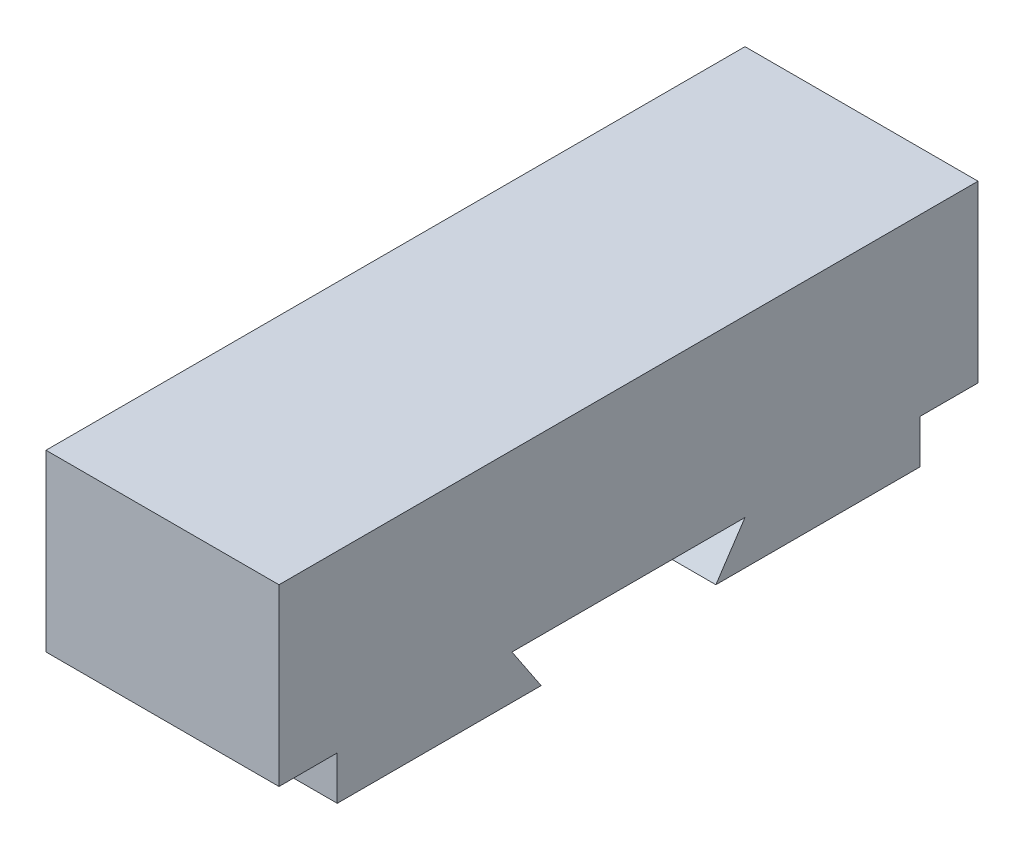
ISO-10303-21;
HEADER;
FILE_DESCRIPTION(('STEP AP214'),'2;1');
FILE_NAME('part.step','',(''),(''),'','','');
FILE_SCHEMA(('AUTOMOTIVE_DESIGN { 1 0 10303 214 1 1 1 1 }'));
ENDSEC;
DATA;
#1=APPLICATION_CONTEXT('core data for automotive mechanical design processes');
#2=APPLICATION_PROTOCOL_DEFINITION('international standard','automotive_design',2000,#1);
#3=PRODUCT_CONTEXT('',#1,'mechanical');
#4=PRODUCT('Part','Part','',(#3));
#5=PRODUCT_RELATED_PRODUCT_CATEGORY('part','',(#4));
#6=PRODUCT_DEFINITION_FORMATION('','',#4);
#7=PRODUCT_DEFINITION_CONTEXT('part definition',#1,'design');
#8=PRODUCT_DEFINITION('design','',#6,#7);
#9=PRODUCT_DEFINITION_SHAPE('','',#8);
#10=(LENGTH_UNIT() NAMED_UNIT(*) SI_UNIT(.MILLI.,.METRE.));
#11=(NAMED_UNIT(*) PLANE_ANGLE_UNIT() SI_UNIT($,.RADIAN.));
#12=(NAMED_UNIT(*) SI_UNIT($,.STERADIAN.) SOLID_ANGLE_UNIT());
#13=UNCERTAINTY_MEASURE_WITH_UNIT(LENGTH_MEASURE(1.E-05),#10,'distance_accuracy_value','');
#14=(GEOMETRIC_REPRESENTATION_CONTEXT(3) GLOBAL_UNCERTAINTY_ASSIGNED_CONTEXT((#13)) GLOBAL_UNIT_ASSIGNED_CONTEXT((#10,
#11,#12)) REPRESENTATION_CONTEXT('',''));
#15=CARTESIAN_POINT('',(0.,0.,0.));
#16=DIRECTION('',(0.,0.,1.));
#17=DIRECTION('',(1.,0.,0.));
#18=AXIS2_PLACEMENT_3D('',#15,#16,#17);
#19=CARTESIAN_POINT('',(-203.2,25.4,63.5000000000001));
#20=DIRECTION('',(0.,0.,1.));
#21=DIRECTION('',(1.,0.,0.));
#22=AXIS2_PLACEMENT_3D('',#19,#20,#21);
#23=PLANE('',#22);
#24=DIRECTION('',(0.,1.,0.));
#25=VECTOR('',#24,1.);
#26=CARTESIAN_POINT('',(-254.,25.4,63.5000000000001));
#27=LINE('',#26,#25);
#28=CARTESIAN_POINT('',(-254.,15.875,63.5000000000001));
#29=VERTEX_POINT('',#28);
#30=CARTESIAN_POINT('',(-254.,25.4,63.5000000000001));
#31=VERTEX_POINT('',#30);
#32=EDGE_CURVE('E153',#29,#31,#27,.T.);
#33=ORIENTED_EDGE('',*,*,#32,.F.);
#34=DIRECTION('',(-1.,0.,0.));
#35=VECTOR('',#34,1.);
#36=CARTESIAN_POINT('',(-203.2,15.875,63.5000000000001));
#37=LINE('',#36,#35);
#38=CARTESIAN_POINT('',(-203.2,15.875,63.5000000000001));
#39=VERTEX_POINT('',#38);
#40=EDGE_CURVE('E11',#39,#29,#37,.T.);
#41=ORIENTED_EDGE('',*,*,#40,.F.);
#42=DIRECTION('',(0.,1.,0.));
#43=VECTOR('',#42,1.);
#44=CARTESIAN_POINT('',(-203.2,25.4,63.5000000000001));
#45=LINE('',#44,#43);
#46=CARTESIAN_POINT('',(-203.2,25.4,63.5000000000001));
#47=VERTEX_POINT('',#46);
#48=EDGE_CURVE('E185',#39,#47,#45,.T.);
#49=ORIENTED_EDGE('',*,*,#48,.T.);
#50=DIRECTION('',(-1.,0.,0.));
#51=VECTOR('',#50,1.);
#52=CARTESIAN_POINT('',(-203.2,25.4,63.5000000000001));
#53=LINE('',#52,#51);
#54=EDGE_CURVE('E35',#47,#31,#53,.T.);
#55=ORIENTED_EDGE('',*,*,#54,.T.);
#56=EDGE_LOOP('',(#33,#41,#49,#55));
#57=FACE_BOUND('',#56,.T.);
#58=ADVANCED_FACE('F32',(#57),#23,.T.);
#59=CARTESIAN_POINT('',(-203.2,15.875,63.5000000000001));
#60=DIRECTION('',(0.,-1.,0.));
#61=DIRECTION('',(0.,0.,-1.));
#62=AXIS2_PLACEMENT_3D('',#59,#60,#61);
#63=PLANE('',#62);
#64=DIRECTION('',(0.,0.,1.));
#65=VECTOR('',#64,1.);
#66=CARTESIAN_POINT('',(-254.,15.875,63.5000000000001));
#67=LINE('',#66,#65);
#68=CARTESIAN_POINT('',(-254.,15.875,19.05));
#69=VERTEX_POINT('',#68);
#70=EDGE_CURVE('E183',#69,#29,#67,.T.);
#71=ORIENTED_EDGE('',*,*,#70,.F.);
#72=DIRECTION('',(-1.,0.,0.));
#73=VECTOR('',#72,1.);
#74=CARTESIAN_POINT('',(-203.2,15.875,19.05));
#75=LINE('',#74,#73);
#76=CARTESIAN_POINT('',(-203.2,15.875,19.05));
#77=VERTEX_POINT('',#76);
#78=EDGE_CURVE('E41',#77,#69,#75,.T.);
#79=ORIENTED_EDGE('',*,*,#78,.F.);
#80=DIRECTION('',(0.,0.,1.));
#81=VECTOR('',#80,1.);
#82=CARTESIAN_POINT('',(-203.2,15.875,63.5000000000001));
#83=LINE('',#82,#81);
#84=EDGE_CURVE('E143',#77,#39,#83,.T.);
#85=ORIENTED_EDGE('',*,*,#84,.T.);
#86=ORIENTED_EDGE('',*,*,#40,.T.);
#87=EDGE_LOOP('',(#71,#79,#85,#86));
#88=FACE_BOUND('',#87,.T.);
#89=ADVANCED_FACE('F205',(#88),#63,.T.);
#90=CARTESIAN_POINT('',(-203.2,15.875,19.05));
#91=DIRECTION('',(0.,0.554700196225229,-0.832050294337844));
#92=DIRECTION('',(0.,0.832050294337844,0.554700196225229));
#93=AXIS2_PLACEMENT_3D('',#90,#91,#92);
#94=PLANE('',#93);
#95=DIRECTION('',(0.,-0.832050294337844,-0.554700196225229));
#96=VECTOR('',#95,1.);
#97=CARTESIAN_POINT('',(-254.,15.875,19.05));
#98=LINE('',#97,#96);
#99=CARTESIAN_POINT('',(-254.,25.4,25.4));
#100=VERTEX_POINT('',#99);
#101=EDGE_CURVE('E130',#100,#69,#98,.T.);
#102=ORIENTED_EDGE('',*,*,#101,.F.);
#103=DIRECTION('',(-1.,0.,0.));
#104=VECTOR('',#103,1.);
#105=CARTESIAN_POINT('',(-203.2,25.4,25.4));
#106=LINE('',#105,#104);
#107=CARTESIAN_POINT('',(-203.2,25.4,25.4));
#108=VERTEX_POINT('',#107);
#109=EDGE_CURVE('E125',#108,#100,#106,.T.);
#110=ORIENTED_EDGE('',*,*,#109,.F.);
#111=DIRECTION('',(0.,-0.832050294337844,-0.554700196225229));
#112=VECTOR('',#111,1.);
#113=CARTESIAN_POINT('',(-203.2,15.875,19.05));
#114=LINE('',#113,#112);
#115=EDGE_CURVE('E128',#108,#77,#114,.T.);
#116=ORIENTED_EDGE('',*,*,#115,.T.);
#117=ORIENTED_EDGE('',*,*,#78,.T.);
#118=EDGE_LOOP('',(#102,#110,#116,#117));
#119=FACE_BOUND('',#118,.T.);
#120=ADVANCED_FACE('F127',(#119),#94,.T.);
#121=CARTESIAN_POINT('',(-203.2,25.4,-25.4));
#122=DIRECTION('',(0.,-1.,0.));
#123=DIRECTION('',(0.,0.,-1.));
#124=AXIS2_PLACEMENT_3D('',#121,#122,#123);
#125=PLANE('',#124);
#126=DIRECTION('',(0.,0.,1.));
#127=VECTOR('',#126,1.);
#128=CARTESIAN_POINT('',(-254.,25.4,-25.4));
#129=LINE('',#128,#127);
#130=CARTESIAN_POINT('',(-254.,25.4,-25.4));
#131=VERTEX_POINT('',#130);
#132=EDGE_CURVE('E180',#131,#100,#129,.T.);
#133=ORIENTED_EDGE('',*,*,#132,.F.);
#134=DIRECTION('',(-1.,0.,0.));
#135=VECTOR('',#134,1.);
#136=CARTESIAN_POINT('',(-203.2,25.4,-25.4));
#137=LINE('',#136,#135);
#138=CARTESIAN_POINT('',(-203.2,25.4,-25.4));
#139=VERTEX_POINT('',#138);
#140=EDGE_CURVE('E135',#139,#131,#137,.T.);
#141=ORIENTED_EDGE('',*,*,#140,.F.);
#142=DIRECTION('',(0.,0.,1.));
#143=VECTOR('',#142,1.);
#144=CARTESIAN_POINT('',(-203.2,25.4,-25.4));
#145=LINE('',#144,#143);
#146=EDGE_CURVE('E141',#139,#108,#145,.T.);
#147=ORIENTED_EDGE('',*,*,#146,.T.);
#148=ORIENTED_EDGE('',*,*,#109,.T.);
#149=EDGE_LOOP('',(#133,#141,#147,#148));
#150=FACE_BOUND('',#149,.T.);
#151=ADVANCED_FACE('F145',(#150),#125,.T.);
#152=CARTESIAN_POINT('',(-203.2,25.4,-25.4));
#153=DIRECTION('',(0.,0.554700196225229,0.832050294337844));
#154=DIRECTION('',(0.,-0.832050294337844,0.554700196225229));
#155=AXIS2_PLACEMENT_3D('',#152,#153,#154);
#156=PLANE('',#155);
#157=DIRECTION('',(0.,0.832050294337844,-0.554700196225229));
#158=VECTOR('',#157,1.);
#159=CARTESIAN_POINT('',(-254.,25.4,-25.4));
#160=LINE('',#159,#158);
#161=CARTESIAN_POINT('',(-254.,15.875,-19.05));
#162=VERTEX_POINT('',#161);
#163=EDGE_CURVE('E177',#162,#131,#160,.T.);
#164=ORIENTED_EDGE('',*,*,#163,.F.);
#165=DIRECTION('',(-1.,0.,0.));
#166=VECTOR('',#165,1.);
#167=CARTESIAN_POINT('',(-203.2,15.875,-19.05));
#168=LINE('',#167,#166);
#169=CARTESIAN_POINT('',(-203.2,15.875,-19.05));
#170=VERTEX_POINT('',#169);
#171=EDGE_CURVE('E189',#170,#162,#168,.T.);
#172=ORIENTED_EDGE('',*,*,#171,.F.);
#173=DIRECTION('',(0.,0.832050294337844,-0.554700196225229));
#174=VECTOR('',#173,1.);
#175=CARTESIAN_POINT('',(-203.2,25.4,-25.4));
#176=LINE('',#175,#174);
#177=EDGE_CURVE('E146',#170,#139,#176,.T.);
#178=ORIENTED_EDGE('',*,*,#177,.T.);
#179=ORIENTED_EDGE('',*,*,#140,.T.);
#180=EDGE_LOOP('',(#164,#172,#178,#179));
#181=FACE_BOUND('',#180,.T.);
#182=ADVANCED_FACE('F219',(#181),#156,.T.);
#183=CARTESIAN_POINT('',(-203.2,15.875,-19.05));
#184=DIRECTION('',(0.,-1.,0.));
#185=DIRECTION('',(0.,0.,-1.));
#186=AXIS2_PLACEMENT_3D('',#183,#184,#185);
#187=PLANE('',#186);
#188=DIRECTION('',(0.,0.,1.));
#189=VECTOR('',#188,1.);
#190=CARTESIAN_POINT('',(-254.,15.875,-19.05));
#191=LINE('',#190,#189);
#192=CARTESIAN_POINT('',(-254.,15.875,-63.5));
#193=VERTEX_POINT('',#192);
#194=EDGE_CURVE('E174',#193,#162,#191,.T.);
#195=ORIENTED_EDGE('',*,*,#194,.F.);
#196=DIRECTION('',(-1.,0.,0.));
#197=VECTOR('',#196,1.);
#198=CARTESIAN_POINT('',(-203.2,15.875,-63.5));
#199=LINE('',#198,#197);
#200=CARTESIAN_POINT('',(-203.2,15.875,-63.5));
#201=VERTEX_POINT('',#200);
#202=EDGE_CURVE('E191',#201,#193,#199,.T.);
#203=ORIENTED_EDGE('',*,*,#202,.F.);
#204=DIRECTION('',(0.,0.,1.));
#205=VECTOR('',#204,1.);
#206=CARTESIAN_POINT('',(-203.2,15.875,-19.05));
#207=LINE('',#206,#205);
#208=EDGE_CURVE('E148',#201,#170,#207,.T.);
#209=ORIENTED_EDGE('',*,*,#208,.T.);
#210=ORIENTED_EDGE('',*,*,#171,.T.);
#211=EDGE_LOOP('',(#195,#203,#209,#210));
#212=FACE_BOUND('',#211,.T.);
#213=ADVANCED_FACE('F222',(#212),#187,.T.);
#214=CARTESIAN_POINT('',(-203.2,15.875,-63.5));
#215=DIRECTION('',(0.,0.,-1.));
#216=DIRECTION('',(-1.,0.,0.));
#217=AXIS2_PLACEMENT_3D('',#214,#215,#216);
#218=PLANE('',#217);
#219=DIRECTION('',(0.,-1.,0.));
#220=VECTOR('',#219,1.);
#221=CARTESIAN_POINT('',(-254.,15.875,-63.5));
#222=LINE('',#221,#220);
#223=CARTESIAN_POINT('',(-254.,25.4,-63.5));
#224=VERTEX_POINT('',#223);
#225=EDGE_CURVE('E171',#224,#193,#222,.T.);
#226=ORIENTED_EDGE('',*,*,#225,.F.);
#227=DIRECTION('',(-1.,0.,0.));
#228=VECTOR('',#227,1.);
#229=CARTESIAN_POINT('',(-203.2,25.4,-63.5));
#230=LINE('',#229,#228);
#231=CARTESIAN_POINT('',(-203.2,25.4,-63.5));
#232=VERTEX_POINT('',#231);
#233=EDGE_CURVE('E193',#232,#224,#230,.T.);
#234=ORIENTED_EDGE('',*,*,#233,.F.);
#235=DIRECTION('',(0.,-1.,0.));
#236=VECTOR('',#235,1.);
#237=CARTESIAN_POINT('',(-203.2,15.875,-63.5));
#238=LINE('',#237,#236);
#239=EDGE_CURVE('E347',#232,#201,#238,.T.);
#240=ORIENTED_EDGE('',*,*,#239,.T.);
#241=ORIENTED_EDGE('',*,*,#202,.T.);
#242=EDGE_LOOP('',(#226,#234,#240,#241));
#243=FACE_BOUND('',#242,.T.);
#244=ADVANCED_FACE('F226',(#243),#218,.T.);
#245=CARTESIAN_POINT('',(-203.2,25.4,-63.5));
#246=DIRECTION('',(0.,-1.,0.));
#247=DIRECTION('',(0.,0.,-1.));
#248=AXIS2_PLACEMENT_3D('',#245,#246,#247);
#249=PLANE('',#248);
#250=DIRECTION('',(0.,0.,1.));
#251=VECTOR('',#250,1.);
#252=CARTESIAN_POINT('',(-254.,25.4,-63.5));
#253=LINE('',#252,#251);
#254=CARTESIAN_POINT('',(-254.,25.4,-76.2));
#255=VERTEX_POINT('',#254);
#256=EDGE_CURVE('E168',#255,#224,#253,.T.);
#257=ORIENTED_EDGE('',*,*,#256,.F.);
#258=DIRECTION('',(-1.,0.,0.));
#259=VECTOR('',#258,1.);
#260=CARTESIAN_POINT('',(-203.2,25.4,-76.2));
#261=LINE('',#260,#259);
#262=CARTESIAN_POINT('',(-203.2,25.4,-76.2));
#263=VERTEX_POINT('',#262);
#264=EDGE_CURVE('E195',#263,#255,#261,.T.);
#265=ORIENTED_EDGE('',*,*,#264,.F.);
#266=DIRECTION('',(0.,0.,1.));
#267=VECTOR('',#266,1.);
#268=CARTESIAN_POINT('',(-203.2,25.4,-63.5));
#269=LINE('',#268,#267);
#270=EDGE_CURVE('E351',#263,#232,#269,.T.);
#271=ORIENTED_EDGE('',*,*,#270,.T.);
#272=ORIENTED_EDGE('',*,*,#233,.T.);
#273=EDGE_LOOP('',(#257,#265,#271,#272));
#274=FACE_BOUND('',#273,.T.);
#275=ADVANCED_FACE('F230',(#274),#249,.T.);
#276=CARTESIAN_POINT('',(-203.2,25.4,-76.2));
#277=DIRECTION('',(0.,0.,-1.));
#278=DIRECTION('',(-1.,0.,0.));
#279=AXIS2_PLACEMENT_3D('',#276,#277,#278);
#280=PLANE('',#279);
#281=DIRECTION('',(0.,-1.,0.));
#282=VECTOR('',#281,1.);
#283=CARTESIAN_POINT('',(-254.,25.4,-76.2));
#284=LINE('',#283,#282);
#285=CARTESIAN_POINT('',(-254.,63.5,-76.2));
#286=VERTEX_POINT('',#285);
#287=EDGE_CURVE('E165',#286,#255,#284,.T.);
#288=ORIENTED_EDGE('',*,*,#287,.F.);
#289=DIRECTION('',(-1.,0.,0.));
#290=VECTOR('',#289,1.);
#291=CARTESIAN_POINT('',(-203.2,63.5,-76.2));
#292=LINE('',#291,#290);
#293=CARTESIAN_POINT('',(-203.2,63.5,-76.2));
#294=VERTEX_POINT('',#293);
#295=EDGE_CURVE('E197',#294,#286,#292,.T.);
#296=ORIENTED_EDGE('',*,*,#295,.F.);
#297=DIRECTION('',(0.,-1.,0.));
#298=VECTOR('',#297,1.);
#299=CARTESIAN_POINT('',(-203.2,25.4,-76.2));
#300=LINE('',#299,#298);
#301=EDGE_CURVE('E340',#294,#263,#300,.T.);
#302=ORIENTED_EDGE('',*,*,#301,.T.);
#303=ORIENTED_EDGE('',*,*,#264,.T.);
#304=EDGE_LOOP('',(#288,#296,#302,#303));
#305=FACE_BOUND('',#304,.T.);
#306=ADVANCED_FACE('F234',(#305),#280,.T.);
#307=CARTESIAN_POINT('',(-203.2,63.5,-76.2));
#308=DIRECTION('',(0.,1.,0.));
#309=DIRECTION('',(0.,0.,1.));
#310=AXIS2_PLACEMENT_3D('',#307,#308,#309);
#311=PLANE('',#310);
#312=DIRECTION('',(0.,0.,-1.));
#313=VECTOR('',#312,1.);
#314=CARTESIAN_POINT('',(-254.,63.5,-76.2));
#315=LINE('',#314,#313);
#316=CARTESIAN_POINT('',(-254.,63.5,76.2));
#317=VERTEX_POINT('',#316);
#318=EDGE_CURVE('E162',#317,#286,#315,.T.);
#319=ORIENTED_EDGE('',*,*,#318,.F.);
#320=DIRECTION('',(-1.,0.,0.));
#321=VECTOR('',#320,1.);
#322=CARTESIAN_POINT('',(-203.2,63.5,76.2));
#323=LINE('',#322,#321);
#324=CARTESIAN_POINT('',(-203.2,63.5,76.2));
#325=VERTEX_POINT('',#324);
#326=EDGE_CURVE('E199',#325,#317,#323,.T.);
#327=ORIENTED_EDGE('',*,*,#326,.F.);
#328=DIRECTION('',(0.,0.,-1.));
#329=VECTOR('',#328,1.);
#330=CARTESIAN_POINT('',(-203.2,63.5,-76.2));
#331=LINE('',#330,#329);
#332=EDGE_CURVE('E336',#325,#294,#331,.T.);
#333=ORIENTED_EDGE('',*,*,#332,.T.);
#334=ORIENTED_EDGE('',*,*,#295,.T.);
#335=EDGE_LOOP('',(#319,#327,#333,#334));
#336=FACE_BOUND('',#335,.T.);
#337=ADVANCED_FACE('F238',(#336),#311,.T.);
#338=CARTESIAN_POINT('',(-203.2,63.5,76.2));
#339=DIRECTION('',(0.,0.,1.));
#340=DIRECTION('',(1.,0.,0.));
#341=AXIS2_PLACEMENT_3D('',#338,#339,#340);
#342=PLANE('',#341);
#343=DIRECTION('',(0.,1.,0.));
#344=VECTOR('',#343,1.);
#345=CARTESIAN_POINT('',(-254.,63.5,76.2));
#346=LINE('',#345,#344);
#347=CARTESIAN_POINT('',(-254.,25.4,76.2));
#348=VERTEX_POINT('',#347);
#349=EDGE_CURVE('E159',#348,#317,#346,.T.);
#350=ORIENTED_EDGE('',*,*,#349,.F.);
#351=DIRECTION('',(-1.,0.,0.));
#352=VECTOR('',#351,1.);
#353=CARTESIAN_POINT('',(-203.2,25.4,76.2));
#354=LINE('',#353,#352);
#355=CARTESIAN_POINT('',(-203.2,25.4,76.2));
#356=VERTEX_POINT('',#355);
#357=EDGE_CURVE('E200',#356,#348,#354,.T.);
#358=ORIENTED_EDGE('',*,*,#357,.F.);
#359=DIRECTION('',(0.,1.,0.));
#360=VECTOR('',#359,1.);
#361=CARTESIAN_POINT('',(-203.2,63.5,76.2));
#362=LINE('',#361,#360);
#363=EDGE_CURVE('E357',#356,#325,#362,.T.);
#364=ORIENTED_EDGE('',*,*,#363,.T.);
#365=ORIENTED_EDGE('',*,*,#326,.T.);
#366=EDGE_LOOP('',(#350,#358,#364,#365));
#367=FACE_BOUND('',#366,.T.);
#368=ADVANCED_FACE('F242',(#367),#342,.T.);
#369=CARTESIAN_POINT('',(-203.2,25.4,76.2));
#370=DIRECTION('',(0.,-1.,0.));
#371=DIRECTION('',(0.,0.,-1.));
#372=AXIS2_PLACEMENT_3D('',#369,#370,#371);
#373=PLANE('',#372);
#374=DIRECTION('',(0.,0.,1.));
#375=VECTOR('',#374,1.);
#376=CARTESIAN_POINT('',(-254.,25.4,76.2));
#377=LINE('',#376,#375);
#378=EDGE_CURVE('E156',#31,#348,#377,.T.);
#379=ORIENTED_EDGE('',*,*,#378,.F.);
#380=ORIENTED_EDGE('',*,*,#54,.F.);
#381=DIRECTION('',(0.,0.,1.));
#382=VECTOR('',#381,1.);
#383=CARTESIAN_POINT('',(-203.2,25.4,76.2));
#384=LINE('',#383,#382);
#385=EDGE_CURVE('E359',#47,#356,#384,.T.);
#386=ORIENTED_EDGE('',*,*,#385,.T.);
#387=ORIENTED_EDGE('',*,*,#357,.T.);
#388=EDGE_LOOP('',(#379,#380,#386,#387));
#389=FACE_BOUND('',#388,.T.);
#390=ADVANCED_FACE('F202',(#389),#373,.T.);
#391=CARTESIAN_POINT('',(-203.2,0.,0.));
#392=DIRECTION('',(1.,0.,0.));
#393=DIRECTION('',(0.,0.,-1.));
#394=AXIS2_PLACEMENT_3D('',#391,#392,#393);
#395=PLANE('',#394);
#396=ORIENTED_EDGE('',*,*,#48,.F.);
#397=ORIENTED_EDGE('',*,*,#84,.F.);
#398=ORIENTED_EDGE('',*,*,#115,.F.);
#399=ORIENTED_EDGE('',*,*,#146,.F.);
#400=ORIENTED_EDGE('',*,*,#177,.F.);
#401=ORIENTED_EDGE('',*,*,#208,.F.);
#402=ORIENTED_EDGE('',*,*,#239,.F.);
#403=ORIENTED_EDGE('',*,*,#270,.F.);
#404=ORIENTED_EDGE('',*,*,#301,.F.);
#405=ORIENTED_EDGE('',*,*,#332,.F.);
#406=ORIENTED_EDGE('',*,*,#363,.F.);
#407=ORIENTED_EDGE('',*,*,#385,.F.);
#408=EDGE_LOOP('',(#396,#397,#398,#399,#400,#401,#402,#403,#404,#405,#406,#407));
#409=FACE_BOUND('',#408,.T.);
#410=ADVANCED_FACE('F139',(#409),#395,.T.);
#411=CARTESIAN_POINT('',(-254.,0.,0.));
#412=DIRECTION('',(1.,0.,0.));
#413=DIRECTION('',(0.,0.,-1.));
#414=AXIS2_PLACEMENT_3D('',#411,#412,#413);
#415=PLANE('',#414);
#416=ORIENTED_EDGE('',*,*,#32,.T.);
#417=ORIENTED_EDGE('',*,*,#378,.T.);
#418=ORIENTED_EDGE('',*,*,#349,.T.);
#419=ORIENTED_EDGE('',*,*,#318,.T.);
#420=ORIENTED_EDGE('',*,*,#287,.T.);
#421=ORIENTED_EDGE('',*,*,#256,.T.);
#422=ORIENTED_EDGE('',*,*,#225,.T.);
#423=ORIENTED_EDGE('',*,*,#194,.T.);
#424=ORIENTED_EDGE('',*,*,#163,.T.);
#425=ORIENTED_EDGE('',*,*,#132,.T.);
#426=ORIENTED_EDGE('',*,*,#101,.T.);
#427=ORIENTED_EDGE('',*,*,#70,.T.);
#428=EDGE_LOOP('',(#416,#417,#418,#419,#420,#421,#422,#423,#424,#425,#426,#427));
#429=FACE_BOUND('',#428,.T.);
#430=ADVANCED_FACE('F204',(#429),#415,.F.);
#431=CLOSED_SHELL('',(#58,#89,#120,#151,#182,#213,#244,#275,#306,#337,#368,#390,#410,#430));
#432=MANIFOLD_SOLID_BREP('B2',#431);
#433=ADVANCED_BREP_SHAPE_REPRESENTATION('',(#18,#432),#14);
#434=SHAPE_DEFINITION_REPRESENTATION(#9,#433);
ENDSEC;
END-ISO-10303-21;
